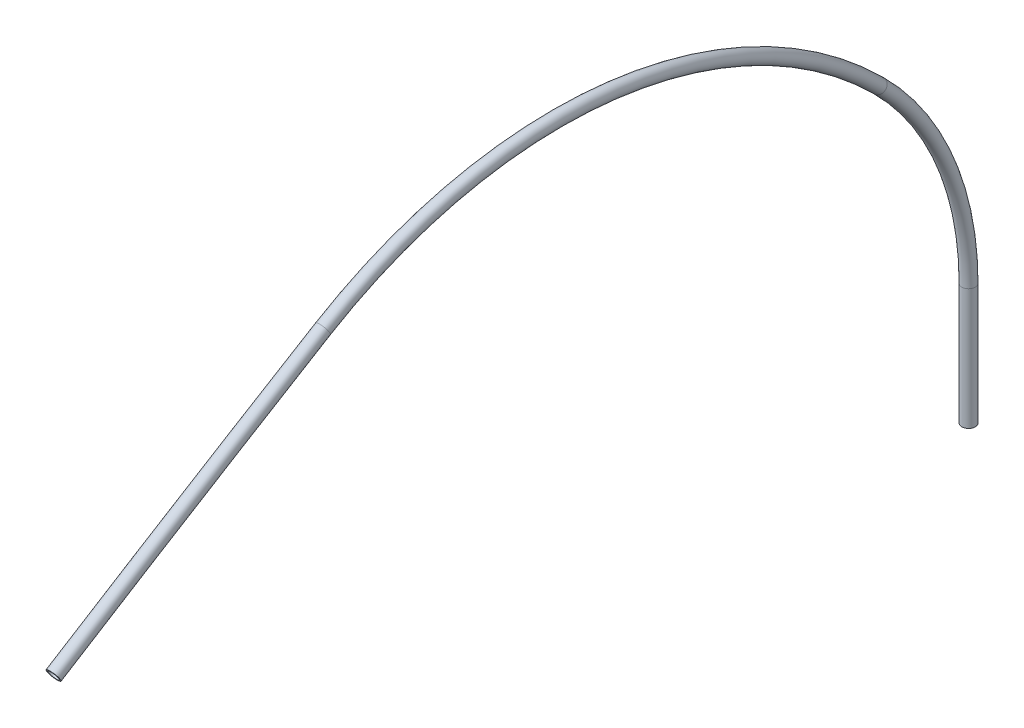
ISO-10303-21;
HEADER;
FILE_DESCRIPTION(('STEP AP214'),'2;1');
FILE_NAME('part.step','',(''),(''),'','','');
FILE_SCHEMA(('AUTOMOTIVE_DESIGN { 1 0 10303 214 1 1 1 1 }'));
ENDSEC;
DATA;
#1=APPLICATION_CONTEXT('core data for automotive mechanical design processes');
#2=APPLICATION_PROTOCOL_DEFINITION('international standard','automotive_design',2000,#1);
#3=PRODUCT_CONTEXT('',#1,'mechanical');
#4=PRODUCT('Part','Part','',(#3));
#5=PRODUCT_RELATED_PRODUCT_CATEGORY('part','',(#4));
#6=PRODUCT_DEFINITION_FORMATION('','',#4);
#7=PRODUCT_DEFINITION_CONTEXT('part definition',#1,'design');
#8=PRODUCT_DEFINITION('design','',#6,#7);
#9=PRODUCT_DEFINITION_SHAPE('','',#8);
#10=(LENGTH_UNIT() NAMED_UNIT(*) SI_UNIT(.MILLI.,.METRE.));
#11=(NAMED_UNIT(*) PLANE_ANGLE_UNIT() SI_UNIT($,.RADIAN.));
#12=(NAMED_UNIT(*) SI_UNIT($,.STERADIAN.) SOLID_ANGLE_UNIT());
#13=UNCERTAINTY_MEASURE_WITH_UNIT(LENGTH_MEASURE(1.E-05),#10,'distance_accuracy_value','');
#14=(GEOMETRIC_REPRESENTATION_CONTEXT(3) GLOBAL_UNCERTAINTY_ASSIGNED_CONTEXT((#13)) GLOBAL_UNIT_ASSIGNED_CONTEXT((#10,
#11,#12)) REPRESENTATION_CONTEXT('',''));
#15=CARTESIAN_POINT('',(0.,0.,0.));
#16=DIRECTION('',(0.,0.,1.));
#17=DIRECTION('',(1.,0.,0.));
#18=AXIS2_PLACEMENT_3D('',#15,#16,#17);
#19=CARTESIAN_POINT('',(0.,-10965.6894871238,-6313.78977456984));
#20=DIRECTION('',(1.,0.,0.));
#21=DIRECTION('',(0.,0.,-1.));
#22=AXIS2_PLACEMENT_3D('',#19,#20,#21);
#23=TOROIDAL_SURFACE('',#22,13200.0086695828,5.);
#24=CARTESIAN_POINT('',(0.,342.677187166263,495.106761350276));
#25=DIRECTION('',(0.,-0.515825156358427,0.856693882356939));
#26=DIRECTION('',(0.,-0.856693882356939,-0.515825156358427));
#27=AXIS2_PLACEMENT_3D('',#24,#25,#26);
#28=CIRCLE('',#27,5.);
#29=CARTESIAN_POINT('',(0.,346.96065657805,497.685887132069));
#30=VERTEX_POINT('',#29);
#31=EDGE_CURVE('E39',#30,#30,#28,.T.);
#32=CARTESIAN_POINT('',(0.,218.772346732391,696.776704971827));
#33=DIRECTION('',(0.,-0.531103172355967,0.847307158186114));
#34=DIRECTION('',(0.,-0.847307158186114,-0.531103172355967));
#35=AXIS2_PLACEMENT_3D('',#32,#33,#34);
#36=CIRCLE('',#35,5.);
#37=CARTESIAN_POINT('',(0.,223.008882523324,699.432220833608));
#38=VERTEX_POINT('',#37);
#39=EDGE_CURVE('E10',#38,#38,#36,.T.);
#40=CARTESIAN_POINT('',(0.,-10965.6894871238,-6313.78977456984));
#41=DIRECTION('',(1.,0.,0.));
#42=DIRECTION('',(0.,0.,-1.));
#43=AXIS2_PLACEMENT_3D('',#40,#41,#42);
#44=CIRCLE('',#43,13205.0086695828);
#45=EDGE_CURVE('',#30,#38,#44,.T.);
#46=ORIENTED_EDGE('',*,*,#31,.T.);
#47=ORIENTED_EDGE('',*,*,#39,.F.);
#48=ORIENTED_EDGE('',*,*,#45,.T.);
#49=ORIENTED_EDGE('',*,*,#45,.F.);
#50=EDGE_LOOP('',(#46,#48,#47,#49));
#51=FACE_BOUND('',#50,.T.);
#52=ADVANCED_FACE('F33',(#51),#23,.T.);
#53=CARTESIAN_POINT('',(0.,50.964369439052,319.463147085266));
#54=DIRECTION('',(1.,0.,0.));
#55=DIRECTION('',(0.,0.,-1.));
#56=AXIS2_PLACEMENT_3D('',#53,#54,#55);
#57=TOROIDAL_SURFACE('',#56,340.509981143614,5.);
#58=CARTESIAN_POINT('',(0.,292.138173860384,79.0837733458247));
#59=DIRECTION('',(0.,0.705939288276128,0.708272349642561));
#60=DIRECTION('',(0.,-0.708272349642561,0.705939288276128));
#61=AXIS2_PLACEMENT_3D('',#58,#59,#60);
#62=CIRCLE('',#61,5.);
#63=CARTESIAN_POINT('',(0.,295.679535608596,75.5540769044441));
#64=VERTEX_POINT('',#63);
#65=EDGE_CURVE('E43',#64,#64,#62,.T.);
#66=CARTESIAN_POINT('',(0.,50.964369439052,319.463147085266));
#67=DIRECTION('',(1.,0.,0.));
#68=DIRECTION('',(0.,0.,-1.));
#69=AXIS2_PLACEMENT_3D('',#66,#67,#68);
#70=CIRCLE('',#69,345.509981143614);
#71=EDGE_CURVE('',#64,#30,#70,.T.);
#72=ORIENTED_EDGE('',*,*,#65,.T.);
#73=ORIENTED_EDGE('',*,*,#31,.F.);
#74=ORIENTED_EDGE('',*,*,#71,.T.);
#75=ORIENTED_EDGE('',*,*,#71,.F.);
#76=EDGE_LOOP('',(#72,#74,#73,#75));
#77=FACE_BOUND('',#76,.T.);
#78=ADVANCED_FACE('F95',(#77),#57,.T.);
#79=CARTESIAN_POINT('',(0.,130.560717654155,240.12899061748));
#80=DIRECTION('',(1.,0.,0.));
#81=DIRECTION('',(0.,0.,-1.));
#82=AXIS2_PLACEMENT_3D('',#79,#80,#81);
#83=TOROIDAL_SURFACE('',#82,228.12899061748,5.);
#84=CARTESIAN_POINT('',(0.,130.560717654155,12.));
#85=DIRECTION('',(0.,1.,0.));
#86=DIRECTION('',(0.,0.,1.));
#87=AXIS2_PLACEMENT_3D('',#84,#85,#86);
#88=CIRCLE('',#87,5.);
#89=CARTESIAN_POINT('',(0.,130.560717654155,7.00000000000001));
#90=VERTEX_POINT('',#89);
#91=EDGE_CURVE('E47',#90,#90,#88,.T.);
#92=CARTESIAN_POINT('',(0.,130.560717654155,240.12899061748));
#93=DIRECTION('',(1.,0.,0.));
#94=DIRECTION('',(0.,0.,-1.));
#95=AXIS2_PLACEMENT_3D('',#92,#93,#94);
#96=CIRCLE('',#95,233.12899061748);
#97=EDGE_CURVE('',#90,#64,#96,.T.);
#98=ORIENTED_EDGE('',*,*,#91,.T.);
#99=ORIENTED_EDGE('',*,*,#65,.F.);
#100=ORIENTED_EDGE('',*,*,#97,.T.);
#101=ORIENTED_EDGE('',*,*,#97,.F.);
#102=EDGE_LOOP('',(#98,#100,#99,#101));
#103=FACE_BOUND('',#102,.T.);
#104=ADVANCED_FACE('F90',(#103),#83,.T.);
#105=CARTESIAN_POINT('',(0.,130.560717654155,12.));
#106=DIRECTION('',(0.,-1.,0.));
#107=DIRECTION('',(0.,0.,-1.));
#108=AXIS2_PLACEMENT_3D('',#105,#106,#107);
#109=CYLINDRICAL_SURFACE('',#108,5.);
#110=ORIENTED_EDGE('',*,*,#91,.F.);
#111=EDGE_LOOP('',(#110));
#112=FACE_BOUND('',#111,.T.);
#113=CARTESIAN_POINT('',(0.,40.,12.));
#114=DIRECTION('',(0.,1.,0.));
#115=DIRECTION('',(0.,0.,1.));
#116=AXIS2_PLACEMENT_3D('',#113,#114,#115);
#117=CIRCLE('',#116,5.);
#118=CARTESIAN_POINT('',(0.,40.,17.));
#119=VERTEX_POINT('',#118);
#120=EDGE_CURVE('E50',#119,#119,#117,.T.);
#121=ORIENTED_EDGE('',*,*,#120,.T.);
#122=EDGE_LOOP('',(#121));
#123=FACE_BOUND('',#122,.T.);
#124=ADVANCED_FACE('F82',(#112,#123),#109,.T.);
#125=CARTESIAN_POINT('',(0.,218.772346732391,696.776704971827));
#126=DIRECTION('',(0.,-0.531103172355967,0.847307158186114));
#127=DIRECTION('',(0.,-0.847307158186114,-0.531103172355967));
#128=AXIS2_PLACEMENT_3D('',#125,#126,#127);
#129=PLANE('',#128);
#130=CARTESIAN_POINT('',(0.,218.772346732388,696.776704971837));
#131=DIRECTION('',(0.,-0.531103172355967,0.847307158186114));
#132=DIRECTION('',(0.,-0.847307158186114,-0.531103172355967));
#133=AXIS2_PLACEMENT_3D('',#130,#131,#132);
#134=CIRCLE('',#133,4.);
#135=CARTESIAN_POINT('',(0.,222.161575365131,698.901117661261));
#136=VERTEX_POINT('',#135);
#137=EDGE_CURVE('E53',#136,#136,#134,.T.);
#138=ORIENTED_EDGE('',*,*,#137,.F.);
#139=EDGE_LOOP('',(#138));
#140=FACE_BOUND('',#139,.T.);
#141=ORIENTED_EDGE('',*,*,#39,.T.);
#142=EDGE_LOOP('',(#141));
#143=FACE_BOUND('',#142,.T.);
#144=ADVANCED_FACE('F80',(#140,#143),#129,.T.);
#145=CARTESIAN_POINT('',(0.,40.,12.));
#146=DIRECTION('',(0.,1.,0.));
#147=DIRECTION('',(0.,0.,1.));
#148=AXIS2_PLACEMENT_3D('',#145,#146,#147);
#149=PLANE('',#148);
#150=CARTESIAN_POINT('',(0.,40.,12.));
#151=DIRECTION('',(0.,1.,0.));
#152=DIRECTION('',(0.,0.,1.));
#153=AXIS2_PLACEMENT_3D('',#150,#151,#152);
#154=CIRCLE('',#153,4.);
#155=CARTESIAN_POINT('',(0.,40.,16.));
#156=VERTEX_POINT('',#155);
#157=EDGE_CURVE('E56',#156,#156,#154,.T.);
#158=ORIENTED_EDGE('',*,*,#157,.T.);
#159=EDGE_LOOP('',(#158));
#160=FACE_BOUND('',#159,.T.);
#161=ORIENTED_EDGE('',*,*,#120,.F.);
#162=EDGE_LOOP('',(#161));
#163=FACE_BOUND('',#162,.T.);
#164=ADVANCED_FACE('F76',(#160,#163),#149,.F.);
#165=CARTESIAN_POINT('',(0.,-10965.6894871238,-6313.78977456984));
#166=DIRECTION('',(1.,0.,0.));
#167=DIRECTION('',(0.,0.,-1.));
#168=AXIS2_PLACEMENT_3D('',#165,#166,#167);
#169=TOROIDAL_SURFACE('',#168,13200.0086695828,4.);
#170=CARTESIAN_POINT('',(0.,342.677187166261,495.106761350277));
#171=DIRECTION('',(0.,0.515825156358427,-0.856693882356939));
#172=DIRECTION('',(0.,0.856693882356939,0.515825156358427));
#173=AXIS2_PLACEMENT_3D('',#170,#171,#172);
#174=CIRCLE('',#173,4.);
#175=CARTESIAN_POINT('',(0.,346.10396269569,497.170061975711));
#176=VERTEX_POINT('',#175);
#177=EDGE_CURVE('E62',#176,#176,#174,.F.);
#178=CARTESIAN_POINT('',(0.,-10965.6894871238,-6313.78977456984));
#179=DIRECTION('',(1.,0.,0.));
#180=DIRECTION('',(0.,0.,-1.));
#181=AXIS2_PLACEMENT_3D('',#178,#179,#180);
#182=CIRCLE('',#181,13204.0086695828);
#183=EDGE_CURVE('',#176,#136,#182,.T.);
#184=ORIENTED_EDGE('',*,*,#177,.F.);
#185=ORIENTED_EDGE('',*,*,#137,.T.);
#186=ORIENTED_EDGE('',*,*,#183,.T.);
#187=ORIENTED_EDGE('',*,*,#183,.F.);
#188=EDGE_LOOP('',(#184,#186,#185,#187));
#189=FACE_BOUND('',#188,.T.);
#190=ADVANCED_FACE('F73',(#189),#169,.F.);
#191=CARTESIAN_POINT('',(0.,50.964369439052,319.463147085266));
#192=DIRECTION('',(1.,0.,0.));
#193=DIRECTION('',(0.,0.,-1.));
#194=AXIS2_PLACEMENT_3D('',#191,#192,#193);
#195=TOROIDAL_SURFACE('',#194,340.509981143614,4.);
#196=CARTESIAN_POINT('',(0.,292.138173860384,79.0837733458247));
#197=DIRECTION('',(0.,-0.705939288276128,-0.70827234964256));
#198=DIRECTION('',(0.,0.70827234964256,-0.705939288276128));
#199=AXIS2_PLACEMENT_3D('',#196,#197,#198);
#200=CIRCLE('',#199,4.);
#201=CARTESIAN_POINT('',(0.,294.971263258954,76.2600161927202));
#202=VERTEX_POINT('',#201);
#203=EDGE_CURVE('E65',#202,#202,#200,.F.);
#204=CARTESIAN_POINT('',(0.,50.964369439052,319.463147085266));
#205=DIRECTION('',(1.,0.,0.));
#206=DIRECTION('',(0.,0.,-1.));
#207=AXIS2_PLACEMENT_3D('',#204,#205,#206);
#208=CIRCLE('',#207,344.509981143614);
#209=EDGE_CURVE('',#202,#176,#208,.T.);
#210=ORIENTED_EDGE('',*,*,#203,.F.);
#211=ORIENTED_EDGE('',*,*,#177,.T.);
#212=ORIENTED_EDGE('',*,*,#209,.T.);
#213=ORIENTED_EDGE('',*,*,#209,.F.);
#214=EDGE_LOOP('',(#210,#212,#211,#213));
#215=FACE_BOUND('',#214,.T.);
#216=ADVANCED_FACE('F71',(#215),#195,.F.);
#217=CARTESIAN_POINT('',(0.,130.560717654155,240.12899061748));
#218=DIRECTION('',(1.,0.,0.));
#219=DIRECTION('',(0.,0.,-1.));
#220=AXIS2_PLACEMENT_3D('',#217,#218,#219);
#221=TOROIDAL_SURFACE('',#220,228.12899061748,4.);
#222=CARTESIAN_POINT('',(0.,130.560717654155,12.));
#223=DIRECTION('',(0.,-1.,0.));
#224=DIRECTION('',(0.,0.,-1.));
#225=AXIS2_PLACEMENT_3D('',#222,#223,#224);
#226=CIRCLE('',#225,4.);
#227=CARTESIAN_POINT('',(0.,130.560717654155,8.00000000000001));
#228=VERTEX_POINT('',#227);
#229=EDGE_CURVE('E59',#228,#228,#226,.F.);
#230=CARTESIAN_POINT('',(0.,130.560717654155,240.12899061748));
#231=DIRECTION('',(1.,0.,0.));
#232=DIRECTION('',(0.,0.,-1.));
#233=AXIS2_PLACEMENT_3D('',#230,#231,#232);
#234=CIRCLE('',#233,232.12899061748);
#235=EDGE_CURVE('',#228,#202,#234,.T.);
#236=ORIENTED_EDGE('',*,*,#229,.F.);
#237=ORIENTED_EDGE('',*,*,#203,.T.);
#238=ORIENTED_EDGE('',*,*,#235,.T.);
#239=ORIENTED_EDGE('',*,*,#235,.F.);
#240=EDGE_LOOP('',(#236,#238,#237,#239));
#241=FACE_BOUND('',#240,.T.);
#242=ADVANCED_FACE('F144',(#241),#221,.F.);
#243=CARTESIAN_POINT('',(0.,130.560717654155,12.));
#244=DIRECTION('',(0.,-1.,0.));
#245=DIRECTION('',(0.,0.,-1.));
#246=AXIS2_PLACEMENT_3D('',#243,#244,#245);
#247=CYLINDRICAL_SURFACE('',#246,4.);
#248=ORIENTED_EDGE('',*,*,#229,.T.);
#249=EDGE_LOOP('',(#248));
#250=FACE_BOUND('',#249,.T.);
#251=ORIENTED_EDGE('',*,*,#157,.F.);
#252=EDGE_LOOP('',(#251));
#253=FACE_BOUND('',#252,.T.);
#254=ADVANCED_FACE('F154',(#250,#253),#247,.F.);
#255=CLOSED_SHELL('',(#52,#78,#104,#124,#144,#164,#190,#216,#242,#254));
#256=MANIFOLD_SOLID_BREP('B2',#255);
#257=ADVANCED_BREP_SHAPE_REPRESENTATION('',(#18,#256),#14);
#258=SHAPE_DEFINITION_REPRESENTATION(#9,#257);
ENDSEC;
END-ISO-10303-21;
